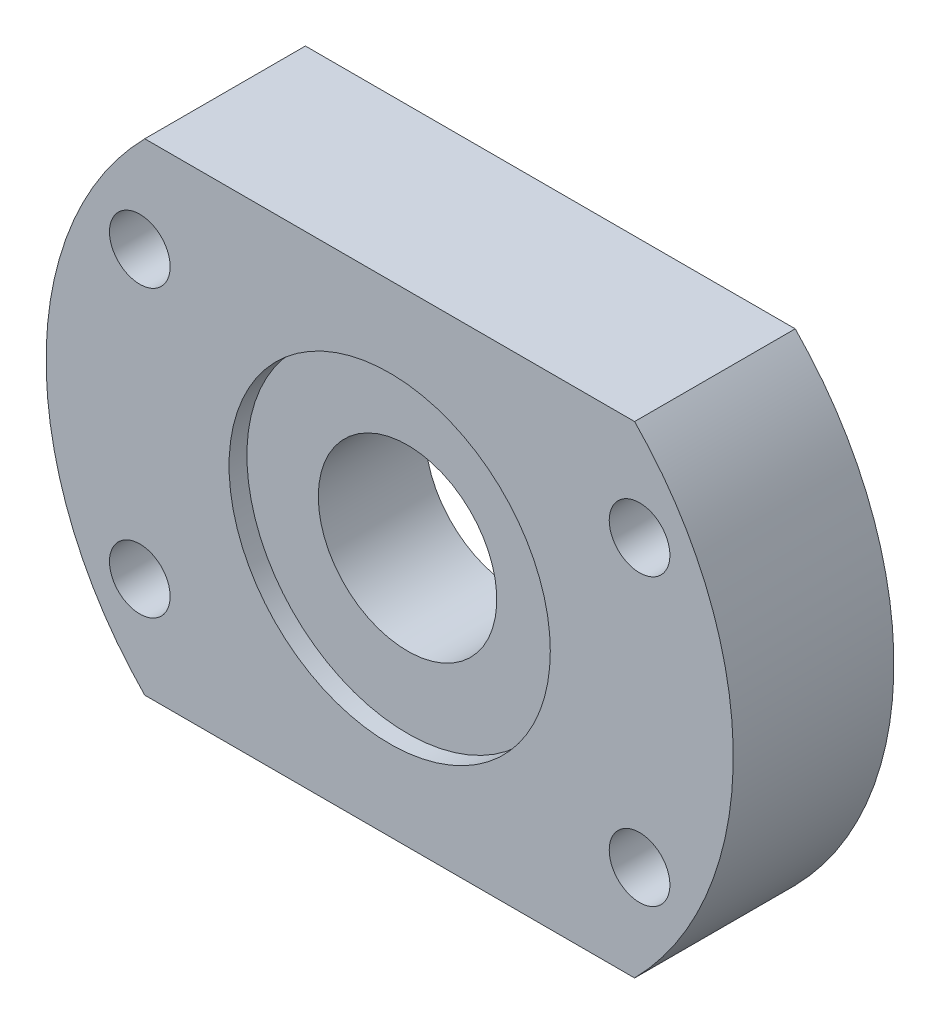
ISO-10303-21;
HEADER;
FILE_DESCRIPTION(('STEP AP214'),'2;1');
FILE_NAME('part.step','',(''),(''),'','','');
FILE_SCHEMA(('AUTOMOTIVE_DESIGN { 1 0 10303 214 1 1 1 1 }'));
ENDSEC;
DATA;
#1=APPLICATION_CONTEXT('core data for automotive mechanical design processes');
#2=APPLICATION_PROTOCOL_DEFINITION('international standard','automotive_design',2000,#1);
#3=PRODUCT_CONTEXT('',#1,'mechanical');
#4=PRODUCT('Part','Part','',(#3));
#5=PRODUCT_RELATED_PRODUCT_CATEGORY('part','',(#4));
#6=PRODUCT_DEFINITION_FORMATION('','',#4);
#7=PRODUCT_DEFINITION_CONTEXT('part definition',#1,'design');
#8=PRODUCT_DEFINITION('design','',#6,#7);
#9=PRODUCT_DEFINITION_SHAPE('','',#8);
#10=(LENGTH_UNIT() NAMED_UNIT(*) SI_UNIT(.MILLI.,.METRE.));
#11=(NAMED_UNIT(*) PLANE_ANGLE_UNIT() SI_UNIT($,.RADIAN.));
#12=(NAMED_UNIT(*) SI_UNIT($,.STERADIAN.) SOLID_ANGLE_UNIT());
#13=UNCERTAINTY_MEASURE_WITH_UNIT(LENGTH_MEASURE(1.E-05),#10,'distance_accuracy_value','');
#14=(GEOMETRIC_REPRESENTATION_CONTEXT(3) GLOBAL_UNCERTAINTY_ASSIGNED_CONTEXT((#13)) GLOBAL_UNIT_ASSIGNED_CONTEXT((#10,
#11,#12)) REPRESENTATION_CONTEXT('',''));
#15=CARTESIAN_POINT('',(0.,0.,0.));
#16=DIRECTION('',(0.,0.,1.));
#17=DIRECTION('',(1.,0.,0.));
#18=AXIS2_PLACEMENT_3D('',#15,#16,#17);
#19=CARTESIAN_POINT('',(452.260652388512,-401.151572168843,-579.35));
#20=DIRECTION('',(0.,0.,1.));
#21=DIRECTION('',(1.,0.,0.));
#22=AXIS2_PLACEMENT_3D('',#19,#20,#21);
#23=PLANE('',#22);
#24=CARTESIAN_POINT('',(476.510652388512,-401.151572168843,-579.35));
#25=DIRECTION('',(0.,0.,-1.));
#26=DIRECTION('',(-1.,0.,0.));
#27=AXIS2_PLACEMENT_3D('',#24,#25,#26);
#28=CIRCLE('',#27,10.);
#29=CARTESIAN_POINT('',(466.510652388512,-401.151572168843,-579.35));
#30=VERTEX_POINT('',#29);
#31=EDGE_CURVE('E20',#30,#30,#28,.F.);
#32=ORIENTED_EDGE('',*,*,#31,.T.);
#33=EDGE_LOOP('',(#32));
#34=FACE_BOUND('',#33,.T.);
#35=CARTESIAN_POINT('',(476.510652388512,-401.151572168843,-579.35));
#36=DIRECTION('',(0.,0.,1.));
#37=DIRECTION('',(1.,0.,0.));
#38=AXIS2_PLACEMENT_3D('',#35,#36,#37);
#39=CIRCLE('',#38,21.);
#40=CARTESIAN_POINT('',(497.510652388512,-401.151572168843,-579.35));
#41=VERTEX_POINT('',#40);
#42=EDGE_CURVE('E147',#41,#41,#39,.F.);
#43=ORIENTED_EDGE('',*,*,#42,.T.);
#44=EDGE_LOOP('',(#43));
#45=FACE_BOUND('',#44,.T.);
#46=ADVANCED_FACE('F17',(#34,#45),#23,.F.);
#47=CARTESIAN_POINT('',(476.510652388512,-401.151572168843,-565.35));
#48=DIRECTION('',(0.,0.,-1.));
#49=DIRECTION('',(-1.,0.,0.));
#50=AXIS2_PLACEMENT_3D('',#47,#48,#49);
#51=CYLINDRICAL_SURFACE('',#50,10.);
#52=ORIENTED_EDGE('',*,*,#31,.F.);
#53=EDGE_LOOP('',(#52));
#54=FACE_BOUND('',#53,.T.);
#55=CARTESIAN_POINT('',(476.510652388512,-401.151572168843,-567.35));
#56=DIRECTION('',(0.,0.,-1.));
#57=DIRECTION('',(-1.,0.,0.));
#58=AXIS2_PLACEMENT_3D('',#55,#56,#57);
#59=CIRCLE('',#58,10.);
#60=CARTESIAN_POINT('',(466.510652388512,-401.151572168843,-567.35));
#61=VERTEX_POINT('',#60);
#62=EDGE_CURVE('E145',#61,#61,#59,.T.);
#63=ORIENTED_EDGE('',*,*,#62,.F.);
#64=EDGE_LOOP('',(#63));
#65=FACE_BOUND('',#64,.T.);
#66=ADVANCED_FACE('F155',(#54,#65),#51,.F.);
#67=CARTESIAN_POINT('',(448.510652388512,-417.151572168843,-583.35));
#68=DIRECTION('',(0.,0.,-1.));
#69=DIRECTION('',(-1.,0.,0.));
#70=AXIS2_PLACEMENT_3D('',#67,#68,#69);
#71=CYLINDRICAL_SURFACE('',#70,5.5);
#72=CARTESIAN_POINT('',(448.510652388512,-417.151572168843,-583.35));
#73=DIRECTION('',(0.,0.,-1.));
#74=DIRECTION('',(-1.,0.,0.));
#75=AXIS2_PLACEMENT_3D('',#72,#73,#74);
#76=CIRCLE('',#75,5.5);
#77=CARTESIAN_POINT('',(443.010652388512,-417.151572168843,-583.35));
#78=VERTEX_POINT('',#77);
#79=EDGE_CURVE('E130',#78,#78,#76,.F.);
#80=ORIENTED_EDGE('',*,*,#79,.F.);
#81=EDGE_LOOP('',(#80));
#82=FACE_BOUND('',#81,.T.);
#83=CARTESIAN_POINT('',(448.510652388512,-417.151572168843,-576.85));
#84=DIRECTION('',(0.,0.,-1.));
#85=DIRECTION('',(-1.,0.,0.));
#86=AXIS2_PLACEMENT_3D('',#83,#84,#85);
#87=CIRCLE('',#86,5.5);
#88=CARTESIAN_POINT('',(443.010652388512,-417.151572168843,-576.85));
#89=VERTEX_POINT('',#88);
#90=EDGE_CURVE('E133',#89,#89,#87,.T.);
#91=ORIENTED_EDGE('',*,*,#90,.F.);
#92=EDGE_LOOP('',(#91));
#93=FACE_BOUND('',#92,.T.);
#94=ADVANCED_FACE('F158',(#82,#93),#71,.F.);
#95=CARTESIAN_POINT('',(476.510652388512,-401.151572168843,-583.35));
#96=DIRECTION('',(0.,0.,1.));
#97=DIRECTION('',(1.,0.,0.));
#98=AXIS2_PLACEMENT_3D('',#95,#96,#97);
#99=CYLINDRICAL_SURFACE('',#98,21.);
#100=ORIENTED_EDGE('',*,*,#42,.F.);
#101=EDGE_LOOP('',(#100));
#102=FACE_BOUND('',#101,.T.);
#103=CARTESIAN_POINT('',(476.510652388512,-401.151572168843,-583.35));
#104=DIRECTION('',(0.,0.,1.));
#105=DIRECTION('',(1.,0.,0.));
#106=AXIS2_PLACEMENT_3D('',#103,#104,#105);
#107=CIRCLE('',#106,21.);
#108=CARTESIAN_POINT('',(497.510652388512,-401.151572168843,-583.35));
#109=VERTEX_POINT('',#108);
#110=EDGE_CURVE('E127',#109,#109,#107,.T.);
#111=ORIENTED_EDGE('',*,*,#110,.F.);
#112=EDGE_LOOP('',(#111));
#113=FACE_BOUND('',#112,.T.);
#114=ADVANCED_FACE('F245',(#102,#113),#99,.F.);
#115=CARTESIAN_POINT('',(504.510652388512,-417.151572168843,-583.35));
#116=DIRECTION('',(0.,0.,-1.));
#117=DIRECTION('',(-1.,0.,0.));
#118=AXIS2_PLACEMENT_3D('',#115,#116,#117);
#119=CYLINDRICAL_SURFACE('',#118,5.5);
#120=CARTESIAN_POINT('',(504.510652388512,-417.151572168843,-583.35));
#121=DIRECTION('',(0.,0.,-1.));
#122=DIRECTION('',(-1.,0.,0.));
#123=AXIS2_PLACEMENT_3D('',#120,#121,#122);
#124=CIRCLE('',#123,5.5);
#125=CARTESIAN_POINT('',(499.010652388512,-417.151572168843,-583.35));
#126=VERTEX_POINT('',#125);
#127=EDGE_CURVE('E124',#126,#126,#124,.F.);
#128=ORIENTED_EDGE('',*,*,#127,.F.);
#129=EDGE_LOOP('',(#128));
#130=FACE_BOUND('',#129,.T.);
#131=CARTESIAN_POINT('',(504.510652388512,-417.151572168843,-576.85));
#132=DIRECTION('',(0.,0.,-1.));
#133=DIRECTION('',(-1.,0.,0.));
#134=AXIS2_PLACEMENT_3D('',#131,#132,#133);
#135=CIRCLE('',#134,5.5);
#136=CARTESIAN_POINT('',(499.010652388512,-417.151572168843,-576.85));
#137=VERTEX_POINT('',#136);
#138=EDGE_CURVE('E142',#137,#137,#135,.T.);
#139=ORIENTED_EDGE('',*,*,#138,.F.);
#140=EDGE_LOOP('',(#139));
#141=FACE_BOUND('',#140,.T.);
#142=ADVANCED_FACE('F241',(#130,#141),#119,.F.);
#143=CARTESIAN_POINT('',(504.510652388512,-385.151572168843,-583.35));
#144=DIRECTION('',(0.,0.,-1.));
#145=DIRECTION('',(-1.,0.,0.));
#146=AXIS2_PLACEMENT_3D('',#143,#144,#145);
#147=CYLINDRICAL_SURFACE('',#146,5.5);
#148=CARTESIAN_POINT('',(504.510652388512,-385.151572168843,-583.35));
#149=DIRECTION('',(0.,0.,-1.));
#150=DIRECTION('',(-1.,0.,0.));
#151=AXIS2_PLACEMENT_3D('',#148,#149,#150);
#152=CIRCLE('',#151,5.5);
#153=CARTESIAN_POINT('',(499.010652388512,-385.151572168843,-583.35));
#154=VERTEX_POINT('',#153);
#155=EDGE_CURVE('E121',#154,#154,#152,.F.);
#156=ORIENTED_EDGE('',*,*,#155,.F.);
#157=EDGE_LOOP('',(#156));
#158=FACE_BOUND('',#157,.T.);
#159=CARTESIAN_POINT('',(504.510652388512,-385.151572168843,-576.85));
#160=DIRECTION('',(0.,0.,-1.));
#161=DIRECTION('',(-1.,0.,0.));
#162=AXIS2_PLACEMENT_3D('',#159,#160,#161);
#163=CIRCLE('',#162,5.5);
#164=CARTESIAN_POINT('',(499.010652388512,-385.151572168843,-576.85));
#165=VERTEX_POINT('',#164);
#166=EDGE_CURVE('E139',#165,#165,#163,.T.);
#167=ORIENTED_EDGE('',*,*,#166,.F.);
#168=EDGE_LOOP('',(#167));
#169=FACE_BOUND('',#168,.T.);
#170=ADVANCED_FACE('F237',(#158,#169),#147,.F.);
#171=CARTESIAN_POINT('',(448.510652388512,-385.151572168843,-583.35));
#172=DIRECTION('',(0.,0.,-1.));
#173=DIRECTION('',(-1.,0.,0.));
#174=AXIS2_PLACEMENT_3D('',#171,#172,#173);
#175=CYLINDRICAL_SURFACE('',#174,5.5);
#176=CARTESIAN_POINT('',(448.510652388512,-385.151572168843,-583.35));
#177=DIRECTION('',(0.,0.,-1.));
#178=DIRECTION('',(-1.,0.,0.));
#179=AXIS2_PLACEMENT_3D('',#176,#177,#178);
#180=CIRCLE('',#179,5.5);
#181=CARTESIAN_POINT('',(443.010652388512,-385.151572168843,-583.35));
#182=VERTEX_POINT('',#181);
#183=EDGE_CURVE('E118',#182,#182,#180,.F.);
#184=ORIENTED_EDGE('',*,*,#183,.F.);
#185=EDGE_LOOP('',(#184));
#186=FACE_BOUND('',#185,.T.);
#187=CARTESIAN_POINT('',(448.510652388512,-385.151572168843,-576.85));
#188=DIRECTION('',(0.,0.,-1.));
#189=DIRECTION('',(-1.,0.,0.));
#190=AXIS2_PLACEMENT_3D('',#187,#188,#189);
#191=CIRCLE('',#190,5.5);
#192=CARTESIAN_POINT('',(443.010652388512,-385.151572168843,-576.85));
#193=VERTEX_POINT('',#192);
#194=EDGE_CURVE('E136',#193,#193,#191,.T.);
#195=ORIENTED_EDGE('',*,*,#194,.F.);
#196=EDGE_LOOP('',(#195));
#197=FACE_BOUND('',#196,.T.);
#198=ADVANCED_FACE('F165',(#186,#197),#175,.F.);
#199=CARTESIAN_POINT('',(452.260652388512,-401.151572168843,-567.35));
#200=DIRECTION('',(0.,0.,1.));
#201=DIRECTION('',(1.,0.,0.));
#202=AXIS2_PLACEMENT_3D('',#199,#200,#201);
#203=PLANE('',#202);
#204=ORIENTED_EDGE('',*,*,#62,.T.);
#205=EDGE_LOOP('',(#204));
#206=FACE_BOUND('',#205,.T.);
#207=CARTESIAN_POINT('',(476.510652388512,-401.151572168843,-567.35));
#208=DIRECTION('',(0.,0.,1.));
#209=DIRECTION('',(1.,0.,0.));
#210=AXIS2_PLACEMENT_3D('',#207,#208,#209);
#211=CIRCLE('',#210,18.);
#212=CARTESIAN_POINT('',(494.510652388512,-401.151572168843,-567.35));
#213=VERTEX_POINT('',#212);
#214=EDGE_CURVE('E115',#213,#213,#211,.T.);
#215=ORIENTED_EDGE('',*,*,#214,.T.);
#216=EDGE_LOOP('',(#215));
#217=FACE_BOUND('',#216,.T.);
#218=ADVANCED_FACE('F161',(#206,#217),#203,.T.);
#219=CARTESIAN_POINT('',(401.510652388512,-401.151572168843,-576.85));
#220=DIRECTION('',(0.,0.,-1.));
#221=DIRECTION('',(-1.,0.,0.));
#222=AXIS2_PLACEMENT_3D('',#219,#220,#221);
#223=PLANE('',#222);
#224=ORIENTED_EDGE('',*,*,#138,.T.);
#225=EDGE_LOOP('',(#224));
#226=FACE_BOUND('',#225,.T.);
#227=CARTESIAN_POINT('',(504.510652388512,-417.151572168843,-576.85));
#228=DIRECTION('',(0.,0.,-1.));
#229=DIRECTION('',(-1.,0.,0.));
#230=AXIS2_PLACEMENT_3D('',#227,#228,#229);
#231=CIRCLE('',#230,3.4);
#232=CARTESIAN_POINT('',(501.110652388512,-417.151572168843,-576.85));
#233=VERTEX_POINT('',#232);
#234=EDGE_CURVE('E112',#233,#233,#231,.F.);
#235=ORIENTED_EDGE('',*,*,#234,.T.);
#236=EDGE_LOOP('',(#235));
#237=FACE_BOUND('',#236,.T.);
#238=ADVANCED_FACE('F164',(#226,#237),#223,.T.);
#239=CARTESIAN_POINT('',(401.510652388512,-401.151572168843,-576.85));
#240=DIRECTION('',(0.,0.,-1.));
#241=DIRECTION('',(-1.,0.,0.));
#242=AXIS2_PLACEMENT_3D('',#239,#240,#241);
#243=PLANE('',#242);
#244=ORIENTED_EDGE('',*,*,#166,.T.);
#245=EDGE_LOOP('',(#244));
#246=FACE_BOUND('',#245,.T.);
#247=CARTESIAN_POINT('',(504.510652388512,-385.151572168843,-576.85));
#248=DIRECTION('',(0.,0.,-1.));
#249=DIRECTION('',(-1.,0.,0.));
#250=AXIS2_PLACEMENT_3D('',#247,#248,#249);
#251=CIRCLE('',#250,3.4);
#252=CARTESIAN_POINT('',(501.110652388512,-385.151572168843,-576.85));
#253=VERTEX_POINT('',#252);
#254=EDGE_CURVE('E109',#253,#253,#251,.F.);
#255=ORIENTED_EDGE('',*,*,#254,.T.);
#256=EDGE_LOOP('',(#255));
#257=FACE_BOUND('',#256,.T.);
#258=ADVANCED_FACE('F220',(#246,#257),#243,.T.);
#259=CARTESIAN_POINT('',(401.510652388512,-401.151572168843,-576.85));
#260=DIRECTION('',(0.,0.,-1.));
#261=DIRECTION('',(-1.,0.,0.));
#262=AXIS2_PLACEMENT_3D('',#259,#260,#261);
#263=PLANE('',#262);
#264=ORIENTED_EDGE('',*,*,#194,.T.);
#265=EDGE_LOOP('',(#264));
#266=FACE_BOUND('',#265,.T.);
#267=CARTESIAN_POINT('',(448.510652388512,-385.151572168843,-576.85));
#268=DIRECTION('',(0.,0.,-1.));
#269=DIRECTION('',(-1.,0.,0.));
#270=AXIS2_PLACEMENT_3D('',#267,#268,#269);
#271=CIRCLE('',#270,3.4);
#272=CARTESIAN_POINT('',(445.110652388512,-385.151572168843,-576.85));
#273=VERTEX_POINT('',#272);
#274=EDGE_CURVE('E106',#273,#273,#271,.F.);
#275=ORIENTED_EDGE('',*,*,#274,.T.);
#276=EDGE_LOOP('',(#275));
#277=FACE_BOUND('',#276,.T.);
#278=ADVANCED_FACE('F222',(#266,#277),#263,.T.);
#279=CARTESIAN_POINT('',(401.510652388512,-401.151572168843,-576.85));
#280=DIRECTION('',(0.,0.,-1.));
#281=DIRECTION('',(-1.,0.,0.));
#282=AXIS2_PLACEMENT_3D('',#279,#280,#281);
#283=PLANE('',#282);
#284=ORIENTED_EDGE('',*,*,#90,.T.);
#285=EDGE_LOOP('',(#284));
#286=FACE_BOUND('',#285,.T.);
#287=CARTESIAN_POINT('',(448.510652388512,-417.151572168843,-576.85));
#288=DIRECTION('',(0.,0.,-1.));
#289=DIRECTION('',(-1.,0.,0.));
#290=AXIS2_PLACEMENT_3D('',#287,#288,#289);
#291=CIRCLE('',#290,3.4);
#292=CARTESIAN_POINT('',(445.110652388512,-417.151572168843,-576.85));
#293=VERTEX_POINT('',#292);
#294=EDGE_CURVE('E75',#293,#293,#291,.F.);
#295=ORIENTED_EDGE('',*,*,#294,.T.);
#296=EDGE_LOOP('',(#295));
#297=FACE_BOUND('',#296,.T.);
#298=ADVANCED_FACE('F182',(#286,#297),#283,.T.);
#299=CARTESIAN_POINT('',(401.510652388512,-401.151572168843,-583.35));
#300=DIRECTION('',(0.,0.,-1.));
#301=DIRECTION('',(-1.,0.,0.));
#302=AXIS2_PLACEMENT_3D('',#299,#300,#301);
#303=PLANE('',#302);
#304=ORIENTED_EDGE('',*,*,#183,.T.);
#305=EDGE_LOOP('',(#304));
#306=FACE_BOUND('',#305,.T.);
#307=ORIENTED_EDGE('',*,*,#155,.T.);
#308=EDGE_LOOP('',(#307));
#309=FACE_BOUND('',#308,.T.);
#310=ORIENTED_EDGE('',*,*,#127,.T.);
#311=EDGE_LOOP('',(#310));
#312=FACE_BOUND('',#311,.T.);
#313=ORIENTED_EDGE('',*,*,#110,.T.);
#314=EDGE_LOOP('',(#313));
#315=FACE_BOUND('',#314,.T.);
#316=ORIENTED_EDGE('',*,*,#79,.T.);
#317=EDGE_LOOP('',(#316));
#318=FACE_BOUND('',#317,.T.);
#319=DIRECTION('',(1.,0.,0.));
#320=VECTOR('',#319,1.);
#321=CARTESIAN_POINT('',(449.065252045285,-428.151572168843,-583.35));
#322=LINE('',#321,#320);
#323=CARTESIAN_POINT('',(449.065252045285,-428.151572168843,-583.35));
#324=VERTEX_POINT('',#323);
#325=CARTESIAN_POINT('',(503.956052731739,-428.151572168843,-583.35));
#326=VERTEX_POINT('',#325);
#327=EDGE_CURVE('E53',#324,#326,#322,.T.);
#328=ORIENTED_EDGE('',*,*,#327,.F.);
#329=CARTESIAN_POINT('',(476.510652388512,-401.151572168843,-583.35));
#330=DIRECTION('',(0.,0.,-1.));
#331=DIRECTION('',(-1.,0.,0.));
#332=AXIS2_PLACEMENT_3D('',#329,#330,#331);
#333=CIRCLE('',#332,38.5);
#334=CARTESIAN_POINT('',(449.065252045285,-374.151572168843,-583.35));
#335=VERTEX_POINT('',#334);
#336=EDGE_CURVE('E71',#335,#324,#333,.F.);
#337=ORIENTED_EDGE('',*,*,#336,.F.);
#338=DIRECTION('',(-1.,0.,0.));
#339=VECTOR('',#338,1.);
#340=CARTESIAN_POINT('',(503.956052731738,-374.151572168843,-583.35));
#341=LINE('',#340,#339);
#342=CARTESIAN_POINT('',(503.956052731739,-374.151572168843,-583.35));
#343=VERTEX_POINT('',#342);
#344=EDGE_CURVE('E67',#343,#335,#341,.T.);
#345=ORIENTED_EDGE('',*,*,#344,.F.);
#346=CARTESIAN_POINT('',(476.510652388512,-401.151572168843,-583.35));
#347=DIRECTION('',(0.,0.,-1.));
#348=DIRECTION('',(-1.,0.,0.));
#349=AXIS2_PLACEMENT_3D('',#346,#347,#348);
#350=CIRCLE('',#349,38.5);
#351=EDGE_CURVE('E58',#326,#343,#350,.F.);
#352=ORIENTED_EDGE('',*,*,#351,.F.);
#353=EDGE_LOOP('',(#328,#337,#345,#352));
#354=FACE_BOUND('',#353,.T.);
#355=ADVANCED_FACE('F70',(#306,#309,#312,#315,#318,#354),#303,.T.);
#356=CARTESIAN_POINT('',(476.510652388512,-401.151572168843,-565.35));
#357=DIRECTION('',(0.,0.,1.));
#358=DIRECTION('',(1.,0.,0.));
#359=AXIS2_PLACEMENT_3D('',#356,#357,#358);
#360=CYLINDRICAL_SURFACE('',#359,18.);
#361=CARTESIAN_POINT('',(476.510652388512,-401.151572168843,-565.35));
#362=DIRECTION('',(0.,0.,1.));
#363=DIRECTION('',(1.,0.,0.));
#364=AXIS2_PLACEMENT_3D('',#361,#362,#363);
#365=CIRCLE('',#364,18.);
#366=CARTESIAN_POINT('',(494.510652388512,-401.151572168843,-565.35));
#367=VERTEX_POINT('',#366);
#368=EDGE_CURVE('E99',#367,#367,#365,.T.);
#369=ORIENTED_EDGE('',*,*,#368,.T.);
#370=EDGE_LOOP('',(#369));
#371=FACE_BOUND('',#370,.T.);
#372=ORIENTED_EDGE('',*,*,#214,.F.);
#373=EDGE_LOOP('',(#372));
#374=FACE_BOUND('',#373,.T.);
#375=ADVANCED_FACE('F169',(#371,#374),#360,.F.);
#376=CARTESIAN_POINT('',(504.510652388512,-417.151572168843,-565.35));
#377=DIRECTION('',(0.,0.,-1.));
#378=DIRECTION('',(-1.,0.,0.));
#379=AXIS2_PLACEMENT_3D('',#376,#377,#378);
#380=CYLINDRICAL_SURFACE('',#379,3.4);
#381=CARTESIAN_POINT('',(504.510652388512,-417.151572168843,-565.35));
#382=DIRECTION('',(0.,0.,-1.));
#383=DIRECTION('',(-1.,0.,0.));
#384=AXIS2_PLACEMENT_3D('',#381,#382,#383);
#385=CIRCLE('',#384,3.4);
#386=CARTESIAN_POINT('',(501.110652388512,-417.151572168843,-565.35));
#387=VERTEX_POINT('',#386);
#388=EDGE_CURVE('E96',#387,#387,#385,.F.);
#389=ORIENTED_EDGE('',*,*,#388,.T.);
#390=EDGE_LOOP('',(#389));
#391=FACE_BOUND('',#390,.T.);
#392=ORIENTED_EDGE('',*,*,#234,.F.);
#393=EDGE_LOOP('',(#392));
#394=FACE_BOUND('',#393,.T.);
#395=ADVANCED_FACE('F171',(#391,#394),#380,.F.);
#396=CARTESIAN_POINT('',(504.510652388512,-385.151572168843,-565.35));
#397=DIRECTION('',(0.,0.,-1.));
#398=DIRECTION('',(-1.,0.,0.));
#399=AXIS2_PLACEMENT_3D('',#396,#397,#398);
#400=CYLINDRICAL_SURFACE('',#399,3.4);
#401=CARTESIAN_POINT('',(504.510652388512,-385.151572168843,-565.35));
#402=DIRECTION('',(0.,0.,-1.));
#403=DIRECTION('',(-1.,0.,0.));
#404=AXIS2_PLACEMENT_3D('',#401,#402,#403);
#405=CIRCLE('',#404,3.4);
#406=CARTESIAN_POINT('',(501.110652388512,-385.151572168843,-565.35));
#407=VERTEX_POINT('',#406);
#408=EDGE_CURVE('E93',#407,#407,#405,.F.);
#409=ORIENTED_EDGE('',*,*,#408,.T.);
#410=EDGE_LOOP('',(#409));
#411=FACE_BOUND('',#410,.T.);
#412=ORIENTED_EDGE('',*,*,#254,.F.);
#413=EDGE_LOOP('',(#412));
#414=FACE_BOUND('',#413,.T.);
#415=ADVANCED_FACE('F179',(#411,#414),#400,.F.);
#416=CARTESIAN_POINT('',(448.510652388512,-385.151572168843,-565.35));
#417=DIRECTION('',(0.,0.,-1.));
#418=DIRECTION('',(-1.,0.,0.));
#419=AXIS2_PLACEMENT_3D('',#416,#417,#418);
#420=CYLINDRICAL_SURFACE('',#419,3.4);
#421=CARTESIAN_POINT('',(448.510652388512,-385.151572168843,-565.35));
#422=DIRECTION('',(0.,0.,-1.));
#423=DIRECTION('',(-1.,0.,0.));
#424=AXIS2_PLACEMENT_3D('',#421,#422,#423);
#425=CIRCLE('',#424,3.4);
#426=CARTESIAN_POINT('',(445.110652388512,-385.151572168843,-565.35));
#427=VERTEX_POINT('',#426);
#428=EDGE_CURVE('E90',#427,#427,#425,.F.);
#429=ORIENTED_EDGE('',*,*,#428,.T.);
#430=EDGE_LOOP('',(#429));
#431=FACE_BOUND('',#430,.T.);
#432=ORIENTED_EDGE('',*,*,#274,.F.);
#433=EDGE_LOOP('',(#432));
#434=FACE_BOUND('',#433,.T.);
#435=ADVANCED_FACE('F207',(#431,#434),#420,.F.);
#436=CARTESIAN_POINT('',(448.510652388512,-417.151572168843,-565.35));
#437=DIRECTION('',(0.,0.,-1.));
#438=DIRECTION('',(-1.,0.,0.));
#439=AXIS2_PLACEMENT_3D('',#436,#437,#438);
#440=CYLINDRICAL_SURFACE('',#439,3.4);
#441=CARTESIAN_POINT('',(448.510652388512,-417.151572168843,-565.35));
#442=DIRECTION('',(0.,0.,-1.));
#443=DIRECTION('',(-1.,0.,0.));
#444=AXIS2_PLACEMENT_3D('',#441,#442,#443);
#445=CIRCLE('',#444,3.4);
#446=CARTESIAN_POINT('',(445.110652388512,-417.151572168843,-565.35));
#447=VERTEX_POINT('',#446);
#448=EDGE_CURVE('E87',#447,#447,#445,.F.);
#449=ORIENTED_EDGE('',*,*,#448,.T.);
#450=EDGE_LOOP('',(#449));
#451=FACE_BOUND('',#450,.T.);
#452=ORIENTED_EDGE('',*,*,#294,.F.);
#453=EDGE_LOOP('',(#452));
#454=FACE_BOUND('',#453,.T.);
#455=ADVANCED_FACE('F204',(#451,#454),#440,.F.);
#456=CARTESIAN_POINT('',(503.956052731738,-374.151572168843,-565.35));
#457=DIRECTION('',(0.,1.,0.));
#458=DIRECTION('',(-1.,0.,0.));
#459=AXIS2_PLACEMENT_3D('',#456,#457,#458);
#460=PLANE('',#459);
#461=ORIENTED_EDGE('',*,*,#344,.T.);
#462=DIRECTION('',(0.,0.,-1.));
#463=VECTOR('',#462,1.);
#464=CARTESIAN_POINT('',(449.065252045285,-374.151572168843,-565.35));
#465=LINE('',#464,#463);
#466=CARTESIAN_POINT('',(449.065252045285,-374.151572168843,-565.35));
#467=VERTEX_POINT('',#466);
#468=EDGE_CURVE('E102',#467,#335,#465,.T.);
#469=ORIENTED_EDGE('',*,*,#468,.F.);
#470=DIRECTION('',(-1.,0.,0.));
#471=VECTOR('',#470,1.);
#472=CARTESIAN_POINT('',(401.510652388512,-374.151572168843,-565.35));
#473=LINE('',#472,#471);
#474=CARTESIAN_POINT('',(503.956052731739,-374.151572168843,-565.35));
#475=VERTEX_POINT('',#474);
#476=EDGE_CURVE('E79',#467,#475,#473,.F.);
#477=ORIENTED_EDGE('',*,*,#476,.T.);
#478=DIRECTION('',(0.,0.,-1.));
#479=VECTOR('',#478,1.);
#480=CARTESIAN_POINT('',(503.956052731739,-374.151572168843,-565.35));
#481=LINE('',#480,#479);
#482=EDGE_CURVE('E63',#343,#475,#481,.F.);
#483=ORIENTED_EDGE('',*,*,#482,.F.);
#484=EDGE_LOOP('',(#461,#469,#477,#483));
#485=FACE_BOUND('',#484,.T.);
#486=ADVANCED_FACE('F78',(#485),#460,.T.);
#487=CARTESIAN_POINT('',(476.510652388512,-401.151572168843,-565.35));
#488=DIRECTION('',(0.,0.,-1.));
#489=DIRECTION('',(-1.,0.,0.));
#490=AXIS2_PLACEMENT_3D('',#487,#488,#489);
#491=CYLINDRICAL_SURFACE('',#490,38.5);
#492=ORIENTED_EDGE('',*,*,#351,.T.);
#493=ORIENTED_EDGE('',*,*,#482,.T.);
#494=CARTESIAN_POINT('',(476.510652388512,-401.151572168843,-565.35));
#495=DIRECTION('',(0.,0.,-1.));
#496=DIRECTION('',(-1.,0.,0.));
#497=AXIS2_PLACEMENT_3D('',#494,#495,#496);
#498=CIRCLE('',#497,38.5);
#499=CARTESIAN_POINT('',(503.956052731739,-428.151572168843,-565.35));
#500=VERTEX_POINT('',#499);
#501=EDGE_CURVE('E85',#475,#500,#498,.T.);
#502=ORIENTED_EDGE('',*,*,#501,.T.);
#503=DIRECTION('',(0.,0.,1.));
#504=VECTOR('',#503,1.);
#505=CARTESIAN_POINT('',(503.956052731738,-428.151572168843,-565.35));
#506=LINE('',#505,#504);
#507=EDGE_CURVE('E65',#326,#500,#506,.T.);
#508=ORIENTED_EDGE('',*,*,#507,.F.);
#509=EDGE_LOOP('',(#492,#493,#502,#508));
#510=FACE_BOUND('',#509,.T.);
#511=ADVANCED_FACE('F60',(#510),#491,.T.);
#512=CARTESIAN_POINT('',(449.065252045285,-428.151572168843,-565.35));
#513=DIRECTION('',(0.,-1.,0.));
#514=DIRECTION('',(1.,0.,0.));
#515=AXIS2_PLACEMENT_3D('',#512,#513,#514);
#516=PLANE('',#515);
#517=ORIENTED_EDGE('',*,*,#327,.T.);
#518=ORIENTED_EDGE('',*,*,#507,.T.);
#519=DIRECTION('',(-1.,0.,0.));
#520=VECTOR('',#519,1.);
#521=CARTESIAN_POINT('',(401.510652388512,-428.151572168843,-565.35));
#522=LINE('',#521,#520);
#523=CARTESIAN_POINT('',(449.065252045285,-428.151572168843,-565.35));
#524=VERTEX_POINT('',#523);
#525=EDGE_CURVE('E26',#500,#524,#522,.T.);
#526=ORIENTED_EDGE('',*,*,#525,.T.);
#527=DIRECTION('',(0.,0.,-1.));
#528=VECTOR('',#527,1.);
#529=CARTESIAN_POINT('',(449.065252045285,-428.151572168843,-565.35));
#530=LINE('',#529,#528);
#531=EDGE_CURVE('E34',#324,#524,#530,.F.);
#532=ORIENTED_EDGE('',*,*,#531,.F.);
#533=EDGE_LOOP('',(#517,#518,#526,#532));
#534=FACE_BOUND('',#533,.T.);
#535=ADVANCED_FACE('F193',(#534),#516,.T.);
#536=CARTESIAN_POINT('',(476.510652388512,-401.151572168843,-565.35));
#537=DIRECTION('',(0.,0.,-1.));
#538=DIRECTION('',(-1.,0.,0.));
#539=AXIS2_PLACEMENT_3D('',#536,#537,#538);
#540=CYLINDRICAL_SURFACE('',#539,38.5);
#541=ORIENTED_EDGE('',*,*,#336,.T.);
#542=ORIENTED_EDGE('',*,*,#531,.T.);
#543=CARTESIAN_POINT('',(476.510652388512,-401.151572168843,-565.35));
#544=DIRECTION('',(0.,0.,-1.));
#545=DIRECTION('',(-1.,0.,0.));
#546=AXIS2_PLACEMENT_3D('',#543,#544,#545);
#547=CIRCLE('',#546,38.5);
#548=EDGE_CURVE('E11',#524,#467,#547,.T.);
#549=ORIENTED_EDGE('',*,*,#548,.T.);
#550=ORIENTED_EDGE('',*,*,#468,.T.);
#551=EDGE_LOOP('',(#541,#542,#549,#550));
#552=FACE_BOUND('',#551,.T.);
#553=ADVANCED_FACE('F187',(#552),#540,.T.);
#554=CARTESIAN_POINT('',(401.510652388512,-401.151572168843,-565.35));
#555=DIRECTION('',(0.,0.,-1.));
#556=DIRECTION('',(-1.,0.,0.));
#557=AXIS2_PLACEMENT_3D('',#554,#555,#556);
#558=PLANE('',#557);
#559=ORIENTED_EDGE('',*,*,#525,.F.);
#560=ORIENTED_EDGE('',*,*,#501,.F.);
#561=ORIENTED_EDGE('',*,*,#476,.F.);
#562=ORIENTED_EDGE('',*,*,#548,.F.);
#563=EDGE_LOOP('',(#559,#560,#561,#562));
#564=FACE_BOUND('',#563,.T.);
#565=ORIENTED_EDGE('',*,*,#448,.F.);
#566=EDGE_LOOP('',(#565));
#567=FACE_BOUND('',#566,.T.);
#568=ORIENTED_EDGE('',*,*,#428,.F.);
#569=EDGE_LOOP('',(#568));
#570=FACE_BOUND('',#569,.T.);
#571=ORIENTED_EDGE('',*,*,#408,.F.);
#572=EDGE_LOOP('',(#571));
#573=FACE_BOUND('',#572,.T.);
#574=ORIENTED_EDGE('',*,*,#388,.F.);
#575=EDGE_LOOP('',(#574));
#576=FACE_BOUND('',#575,.T.);
#577=ORIENTED_EDGE('',*,*,#368,.F.);
#578=EDGE_LOOP('',(#577));
#579=FACE_BOUND('',#578,.T.);
#580=ADVANCED_FACE('F185',(#564,#567,#570,#573,#576,#579),#558,.F.);
#581=CLOSED_SHELL('',(#46,#66,#94,#114,#142,#170,#198,#218,#238,#258,#278,#298,#355,#375,#395,
#415,#435,#455,#486,#511,#535,#553,#580));
#582=MANIFOLD_SOLID_BREP('B1',#581);
#583=ADVANCED_BREP_SHAPE_REPRESENTATION('',(#18,#582),#14);
#584=SHAPE_DEFINITION_REPRESENTATION(#9,#583);
ENDSEC;
END-ISO-10303-21;
